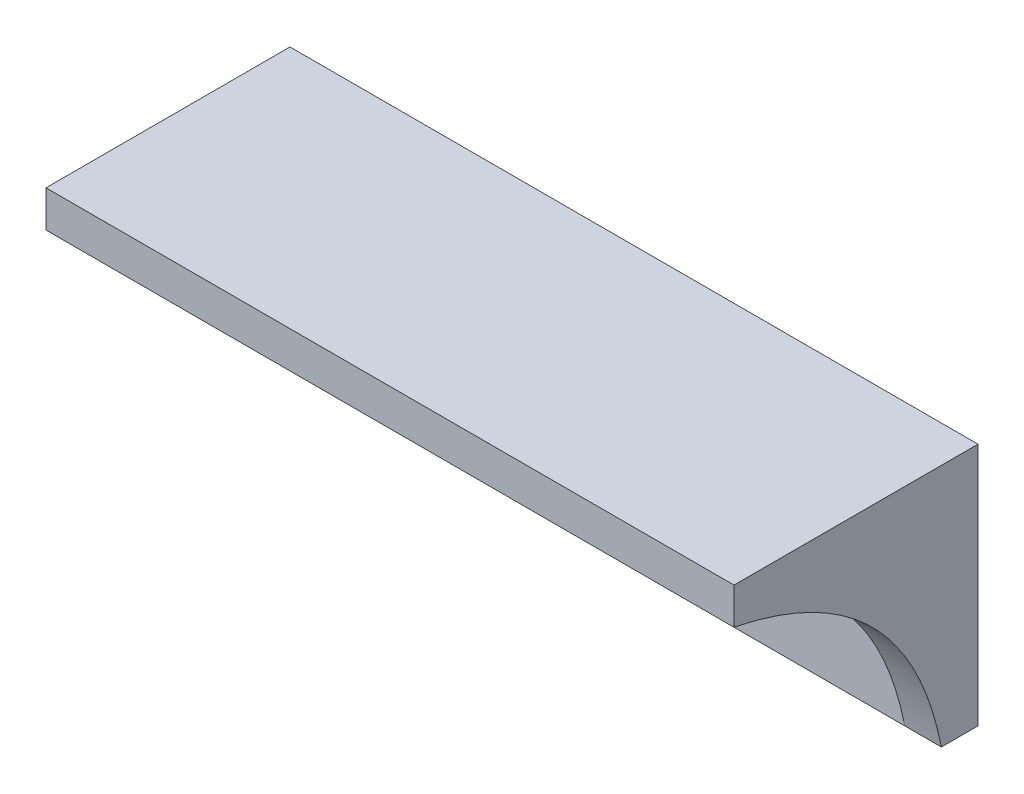
ISO-10303-21;
HEADER;
FILE_DESCRIPTION(('STEP AP214'),'2;1');
FILE_NAME('part.step','',(''),(''),'','','');
FILE_SCHEMA(('AUTOMOTIVE_DESIGN { 1 0 10303 214 1 1 1 1 }'));
ENDSEC;
DATA;
#1=APPLICATION_CONTEXT('core data for automotive mechanical design processes');
#2=APPLICATION_PROTOCOL_DEFINITION('international standard','automotive_design',2000,#1);
#3=PRODUCT_CONTEXT('',#1,'mechanical');
#4=PRODUCT('Part','Part','',(#3));
#5=PRODUCT_RELATED_PRODUCT_CATEGORY('part','',(#4));
#6=PRODUCT_DEFINITION_FORMATION('','',#4);
#7=PRODUCT_DEFINITION_CONTEXT('part definition',#1,'design');
#8=PRODUCT_DEFINITION('design','',#6,#7);
#9=PRODUCT_DEFINITION_SHAPE('','',#8);
#10=(LENGTH_UNIT() NAMED_UNIT(*) SI_UNIT(.MILLI.,.METRE.));
#11=(NAMED_UNIT(*) PLANE_ANGLE_UNIT() SI_UNIT($,.RADIAN.));
#12=(NAMED_UNIT(*) SI_UNIT($,.STERADIAN.) SOLID_ANGLE_UNIT());
#13=UNCERTAINTY_MEASURE_WITH_UNIT(LENGTH_MEASURE(1.E-05),#10,'distance_accuracy_value','');
#14=(GEOMETRIC_REPRESENTATION_CONTEXT(3) GLOBAL_UNCERTAINTY_ASSIGNED_CONTEXT((#13)) GLOBAL_UNIT_ASSIGNED_CONTEXT((#10,
#11,#12)) REPRESENTATION_CONTEXT('',''));
#15=CARTESIAN_POINT('',(0.,0.,0.));
#16=DIRECTION('',(0.,0.,1.));
#17=DIRECTION('',(1.,0.,0.));
#18=AXIS2_PLACEMENT_3D('',#15,#16,#17);
#19=CARTESIAN_POINT('',(0.,0.,3.));
#20=DIRECTION('',(0.,0.,1.));
#21=DIRECTION('',(1.,0.,0.));
#22=AXIS2_PLACEMENT_3D('',#19,#20,#21);
#23=PLANE('',#22);
#24=CARTESIAN_POINT('',(13.35,0.,3.));
#25=DIRECTION('',(0.,0.,1.));
#26=DIRECTION('',(1.,0.,0.));
#27=AXIS2_PLACEMENT_3D('',#24,#25,#26);
#28=CIRCLE('',#27,2.25);
#29=CARTESIAN_POINT('',(15.6,0.,3.));
#30=VERTEX_POINT('',#29);
#31=EDGE_CURVE('E273',#30,#30,#28,.T.);
#32=ORIENTED_EDGE('',*,*,#31,.F.);
#33=EDGE_LOOP('',(#32));
#34=FACE_BOUND('',#33,.T.);
#35=DIRECTION('',(0.,-1.,0.));
#36=VECTOR('',#35,1.);
#37=CARTESIAN_POINT('',(25.2,-10.,3.));
#38=LINE('',#37,#36);
#39=CARTESIAN_POINT('',(25.2,7.,3.));
#40=VERTEX_POINT('',#39);
#41=CARTESIAN_POINT('',(25.2,-10.,3.));
#42=VERTEX_POINT('',#41);
#43=EDGE_CURVE('E153',#40,#42,#38,.T.);
#44=ORIENTED_EDGE('',*,*,#43,.F.);
#45=DIRECTION('',(1.,0.,0.));
#46=VECTOR('',#45,1.);
#47=CARTESIAN_POINT('',(-28.2,7.,3.));
#48=LINE('',#47,#46);
#49=CARTESIAN_POINT('',(1.49999999999999,7.,3.));
#50=VERTEX_POINT('',#49);
#51=EDGE_CURVE('E278',#50,#40,#48,.T.);
#52=ORIENTED_EDGE('',*,*,#51,.F.);
#53=DIRECTION('',(0.,-1.,0.));
#54=VECTOR('',#53,1.);
#55=CARTESIAN_POINT('',(1.49999999999999,-10.,3.));
#56=LINE('',#55,#54);
#57=CARTESIAN_POINT('',(1.49999999999999,-10.,3.));
#58=VERTEX_POINT('',#57);
#59=EDGE_CURVE('E322',#50,#58,#56,.T.);
#60=ORIENTED_EDGE('',*,*,#59,.T.);
#61=DIRECTION('',(1.,0.,0.));
#62=VECTOR('',#61,1.);
#63=CARTESIAN_POINT('',(-28.2,-10.,3.));
#64=LINE('',#63,#62);
#65=EDGE_CURVE('E197',#58,#42,#64,.T.);
#66=ORIENTED_EDGE('',*,*,#65,.T.);
#67=EDGE_LOOP('',(#44,#52,#60,#66));
#68=FACE_BOUND('',#67,.T.);
#69=ADVANCED_FACE('F43',(#34,#68),#23,.T.);
#70=CARTESIAN_POINT('',(-28.2,7.,20.));
#71=DIRECTION('',(0.,1.,0.));
#72=DIRECTION('',(-1.,0.,0.));
#73=AXIS2_PLACEMENT_3D('',#70,#71,#72);
#74=PLANE('',#73);
#75=ORIENTED_EDGE('',*,*,#51,.T.);
#76=DIRECTION('',(0.,0.,-1.));
#77=VECTOR('',#76,1.);
#78=CARTESIAN_POINT('',(25.2,7.,3.));
#79=LINE('',#78,#77);
#80=CARTESIAN_POINT('',(25.2,6.99999999999999,20.));
#81=VERTEX_POINT('',#80);
#82=EDGE_CURVE('E281',#81,#40,#79,.T.);
#83=ORIENTED_EDGE('',*,*,#82,.F.);
#84=DIRECTION('',(1.,0.,0.));
#85=VECTOR('',#84,1.);
#86=CARTESIAN_POINT('',(-28.2,7.,20.));
#87=LINE('',#86,#85);
#88=CARTESIAN_POINT('',(1.49999999999999,7.,20.));
#89=VERTEX_POINT('',#88);
#90=EDGE_CURVE('E180',#89,#81,#87,.T.);
#91=ORIENTED_EDGE('',*,*,#90,.F.);
#92=DIRECTION('',(0.,0.,-1.));
#93=VECTOR('',#92,1.);
#94=CARTESIAN_POINT('',(1.49999999999999,7.,3.));
#95=LINE('',#94,#93);
#96=EDGE_CURVE('E285',#89,#50,#95,.T.);
#97=ORIENTED_EDGE('',*,*,#96,.T.);
#98=EDGE_LOOP('',(#75,#83,#91,#97));
#99=FACE_BOUND('',#98,.T.);
#100=ADVANCED_FACE('F246',(#99),#74,.F.);
#101=CARTESIAN_POINT('',(-13.35,0.,3.));
#102=DIRECTION('',(0.,0.,1.));
#103=DIRECTION('',(1.,0.,0.));
#104=AXIS2_PLACEMENT_3D('',#101,#102,#103);
#105=CIRCLE('',#104,2.25);
#106=CARTESIAN_POINT('',(-11.1,0.,3.));
#107=VERTEX_POINT('',#106);
#108=EDGE_CURVE('E402',#107,#107,#105,.T.);
#109=ORIENTED_EDGE('',*,*,#108,.F.);
#110=EDGE_LOOP('',(#109));
#111=FACE_BOUND('',#110,.T.);
#112=DIRECTION('',(0.,-1.,0.));
#113=VECTOR('',#112,1.);
#114=CARTESIAN_POINT('',(-1.50000000000001,-10.,3.));
#115=LINE('',#114,#113);
#116=CARTESIAN_POINT('',(-1.50000000000001,7.,3.));
#117=VERTEX_POINT('',#116);
#118=CARTESIAN_POINT('',(-1.50000000000001,-10.,3.));
#119=VERTEX_POINT('',#118);
#120=EDGE_CURVE('E305',#117,#119,#115,.T.);
#121=ORIENTED_EDGE('',*,*,#120,.F.);
#122=CARTESIAN_POINT('',(-25.2,7.,3.));
#123=VERTEX_POINT('',#122);
#124=EDGE_CURVE('E205',#123,#117,#48,.T.);
#125=ORIENTED_EDGE('',*,*,#124,.F.);
#126=DIRECTION('',(0.,-1.,0.));
#127=VECTOR('',#126,1.);
#128=CARTESIAN_POINT('',(-25.2,-10.,3.));
#129=LINE('',#128,#127);
#130=CARTESIAN_POINT('',(-25.2,-10.,3.));
#131=VERTEX_POINT('',#130);
#132=EDGE_CURVE('E287',#123,#131,#129,.T.);
#133=ORIENTED_EDGE('',*,*,#132,.T.);
#134=EDGE_CURVE('E166',#131,#119,#64,.T.);
#135=ORIENTED_EDGE('',*,*,#134,.T.);
#136=EDGE_LOOP('',(#121,#125,#133,#135));
#137=FACE_BOUND('',#136,.T.);
#138=ADVANCED_FACE('F244',(#111,#137),#23,.T.);
#139=ORIENTED_EDGE('',*,*,#124,.T.);
#140=DIRECTION('',(0.,0.,-1.));
#141=VECTOR('',#140,1.);
#142=CARTESIAN_POINT('',(-1.50000000000001,7.,3.));
#143=LINE('',#142,#141);
#144=CARTESIAN_POINT('',(-1.50000000000001,6.99999999999999,20.));
#145=VERTEX_POINT('',#144);
#146=EDGE_CURVE('E310',#145,#117,#143,.T.);
#147=ORIENTED_EDGE('',*,*,#146,.F.);
#148=CARTESIAN_POINT('',(-25.2,7.,20.));
#149=VERTEX_POINT('',#148);
#150=EDGE_CURVE('E174',#149,#145,#87,.T.);
#151=ORIENTED_EDGE('',*,*,#150,.F.);
#152=DIRECTION('',(0.,0.,-1.));
#153=VECTOR('',#152,1.);
#154=CARTESIAN_POINT('',(-25.2,7.,3.));
#155=LINE('',#154,#153);
#156=EDGE_CURVE('E214',#149,#123,#155,.T.);
#157=ORIENTED_EDGE('',*,*,#156,.T.);
#158=EDGE_LOOP('',(#139,#147,#151,#157));
#159=FACE_BOUND('',#158,.T.);
#160=ADVANCED_FACE('F241',(#159),#74,.F.);
#161=CARTESIAN_POINT('',(28.2,10.,3.));
#162=DIRECTION('',(-1.,0.,0.));
#163=DIRECTION('',(0.,-1.,0.));
#164=AXIS2_PLACEMENT_3D('',#161,#162,#163);
#165=PLANE('',#164);
#166=DIRECTION('',(0.,1.,0.));
#167=VECTOR('',#166,1.);
#168=CARTESIAN_POINT('',(28.2,10.,0.));
#169=LINE('',#168,#167);
#170=CARTESIAN_POINT('',(28.2,-10.,0.));
#171=VERTEX_POINT('',#170);
#172=CARTESIAN_POINT('',(28.2,10.,0.));
#173=VERTEX_POINT('',#172);
#174=EDGE_CURVE('E206',#171,#173,#169,.T.);
#175=ORIENTED_EDGE('',*,*,#174,.T.);
#176=DIRECTION('',(0.,0.,-1.));
#177=VECTOR('',#176,1.);
#178=CARTESIAN_POINT('',(28.2,10.,3.));
#179=LINE('',#178,#177);
#180=CARTESIAN_POINT('',(28.2,10.,20.));
#181=VERTEX_POINT('',#180);
#182=EDGE_CURVE('E11',#181,#173,#179,.T.);
#183=ORIENTED_EDGE('',*,*,#182,.F.);
#184=DIRECTION('',(0.,1.,0.));
#185=VECTOR('',#184,1.);
#186=CARTESIAN_POINT('',(28.2,10.,20.));
#187=LINE('',#186,#185);
#188=CARTESIAN_POINT('',(28.2,7.,20.));
#189=VERTEX_POINT('',#188);
#190=EDGE_CURVE('E151',#189,#181,#187,.T.);
#191=ORIENTED_EDGE('',*,*,#190,.F.);
#192=CARTESIAN_POINT('',(28.2,-10.,3.));
#193=CARTESIAN_POINT('',(28.2,4.16666666666667,5.83333333333333));
#194=CARTESIAN_POINT('',(28.2,7.,20.));
#195=B_SPLINE_CURVE_WITH_KNOTS('',2,(#192,#193,#194),.UNSPECIFIED.,.F.,.F.,(3,3),(0.,1.),.UNSPECIFIED.);
#196=CARTESIAN_POINT('',(28.2,-10.,3.));
#197=VERTEX_POINT('',#196);
#198=EDGE_CURVE('E131',#197,#189,#195,.T.);
#199=ORIENTED_EDGE('',*,*,#198,.F.);
#200=DIRECTION('',(0.,0.,-1.));
#201=VECTOR('',#200,1.);
#202=CARTESIAN_POINT('',(28.2,-10.,3.));
#203=LINE('',#202,#201);
#204=EDGE_CURVE('E148',#197,#171,#203,.T.);
#205=ORIENTED_EDGE('',*,*,#204,.T.);
#206=EDGE_LOOP('',(#175,#183,#191,#199,#205));
#207=FACE_BOUND('',#206,.T.);
#208=ADVANCED_FACE('F45',(#207),#165,.F.);
#209=CARTESIAN_POINT('',(-28.2,10.,3.));
#210=DIRECTION('',(0.,-1.,0.));
#211=DIRECTION('',(0.,0.,-1.));
#212=AXIS2_PLACEMENT_3D('',#209,#210,#211);
#213=PLANE('',#212);
#214=DIRECTION('',(-1.,0.,0.));
#215=VECTOR('',#214,1.);
#216=CARTESIAN_POINT('',(-28.2,10.,0.));
#217=LINE('',#216,#215);
#218=CARTESIAN_POINT('',(-28.2,10.,0.));
#219=VERTEX_POINT('',#218);
#220=EDGE_CURVE('E344',#173,#219,#217,.T.);
#221=ORIENTED_EDGE('',*,*,#220,.T.);
#222=DIRECTION('',(0.,0.,-1.));
#223=VECTOR('',#222,1.);
#224=CARTESIAN_POINT('',(-28.2,10.,3.));
#225=LINE('',#224,#223);
#226=CARTESIAN_POINT('',(-28.2,10.,20.));
#227=VERTEX_POINT('',#226);
#228=EDGE_CURVE('E53',#227,#219,#225,.T.);
#229=ORIENTED_EDGE('',*,*,#228,.F.);
#230=DIRECTION('',(-1.,0.,0.));
#231=VECTOR('',#230,1.);
#232=CARTESIAN_POINT('',(-28.2,10.,20.));
#233=LINE('',#232,#231);
#234=EDGE_CURVE('E340',#181,#227,#233,.T.);
#235=ORIENTED_EDGE('',*,*,#234,.F.);
#236=ORIENTED_EDGE('',*,*,#182,.T.);
#237=EDGE_LOOP('',(#221,#229,#235,#236));
#238=FACE_BOUND('',#237,.T.);
#239=ADVANCED_FACE('F257',(#238),#213,.F.);
#240=CARTESIAN_POINT('',(-28.2,10.,3.));
#241=DIRECTION('',(1.,0.,0.));
#242=DIRECTION('',(0.,1.,0.));
#243=AXIS2_PLACEMENT_3D('',#240,#241,#242);
#244=PLANE('',#243);
#245=DIRECTION('',(0.,0.,-1.));
#246=VECTOR('',#245,1.);
#247=CARTESIAN_POINT('',(-28.2,-10.,3.));
#248=LINE('',#247,#246);
#249=CARTESIAN_POINT('',(-28.2,-10.,3.));
#250=VERTEX_POINT('',#249);
#251=CARTESIAN_POINT('',(-28.2,-10.,0.));
#252=VERTEX_POINT('',#251);
#253=EDGE_CURVE('E160',#250,#252,#248,.T.);
#254=ORIENTED_EDGE('',*,*,#253,.F.);
#255=CARTESIAN_POINT('',(-28.2,-10.,3.));
#256=CARTESIAN_POINT('',(-28.2,4.16666666666667,5.83333333333333));
#257=CARTESIAN_POINT('',(-28.2,7.,20.));
#258=B_SPLINE_CURVE_WITH_KNOTS('',2,(#255,#256,#257),.UNSPECIFIED.,.F.,.F.,(3,3),(0.,1.),.UNSPECIFIED.);
#259=CARTESIAN_POINT('',(-28.2,6.99999999999999,20.));
#260=VERTEX_POINT('',#259);
#261=EDGE_CURVE('E215',#250,#260,#258,.T.);
#262=ORIENTED_EDGE('',*,*,#261,.T.);
#263=DIRECTION('',(0.,-1.,0.));
#264=VECTOR('',#263,1.);
#265=CARTESIAN_POINT('',(-28.2,10.,20.));
#266=LINE('',#265,#264);
#267=EDGE_CURVE('E185',#227,#260,#266,.T.);
#268=ORIENTED_EDGE('',*,*,#267,.F.);
#269=ORIENTED_EDGE('',*,*,#228,.T.);
#270=DIRECTION('',(0.,-1.,0.));
#271=VECTOR('',#270,1.);
#272=CARTESIAN_POINT('',(-28.2,10.,0.));
#273=LINE('',#272,#271);
#274=EDGE_CURVE('E346',#219,#252,#273,.T.);
#275=ORIENTED_EDGE('',*,*,#274,.T.);
#276=EDGE_LOOP('',(#254,#262,#268,#269,#275));
#277=FACE_BOUND('',#276,.T.);
#278=ADVANCED_FACE('F255',(#277),#244,.F.);
#279=CARTESIAN_POINT('',(-28.2,-10.,3.));
#280=DIRECTION('',(0.,1.,0.));
#281=DIRECTION('',(0.,0.,1.));
#282=AXIS2_PLACEMENT_3D('',#279,#280,#281);
#283=PLANE('',#282);
#284=DIRECTION('',(1.,0.,0.));
#285=VECTOR('',#284,1.);
#286=CARTESIAN_POINT('',(-28.2,-10.,0.));
#287=LINE('',#286,#285);
#288=EDGE_CURVE('E158',#252,#171,#287,.T.);
#289=ORIENTED_EDGE('',*,*,#288,.T.);
#290=ORIENTED_EDGE('',*,*,#204,.F.);
#291=DIRECTION('',(-1.,0.,0.));
#292=VECTOR('',#291,1.);
#293=CARTESIAN_POINT('',(28.2,-10.,3.));
#294=LINE('',#293,#292);
#295=EDGE_CURVE('E128',#197,#42,#294,.T.);
#296=ORIENTED_EDGE('',*,*,#295,.T.);
#297=ORIENTED_EDGE('',*,*,#65,.F.);
#298=DIRECTION('',(-1.,0.,0.));
#299=VECTOR('',#298,1.);
#300=CARTESIAN_POINT('',(1.49999999999999,-10.,3.));
#301=LINE('',#300,#299);
#302=EDGE_CURVE('E317',#58,#119,#301,.T.);
#303=ORIENTED_EDGE('',*,*,#302,.T.);
#304=ORIENTED_EDGE('',*,*,#134,.F.);
#305=EDGE_CURVE('E161',#250,#131,#64,.T.);
#306=ORIENTED_EDGE('',*,*,#305,.F.);
#307=ORIENTED_EDGE('',*,*,#253,.T.);
#308=EDGE_LOOP('',(#289,#290,#296,#297,#303,#304,#306,#307));
#309=FACE_BOUND('',#308,.T.);
#310=ADVANCED_FACE('F155',(#309),#283,.F.);
#311=CARTESIAN_POINT('',(0.,0.,0.));
#312=DIRECTION('',(0.,0.,1.));
#313=DIRECTION('',(1.,0.,0.));
#314=AXIS2_PLACEMENT_3D('',#311,#312,#313);
#315=PLANE('',#314);
#316=CARTESIAN_POINT('',(-13.35,0.,0.));
#317=DIRECTION('',(0.,0.,1.));
#318=DIRECTION('',(1.,0.,0.));
#319=AXIS2_PLACEMENT_3D('',#316,#317,#318);
#320=CIRCLE('',#319,2.25);
#321=CARTESIAN_POINT('',(-11.1,0.,0.));
#322=VERTEX_POINT('',#321);
#323=EDGE_CURVE('E399',#322,#322,#320,.T.);
#324=ORIENTED_EDGE('',*,*,#323,.T.);
#325=EDGE_LOOP('',(#324));
#326=FACE_BOUND('',#325,.T.);
#327=CARTESIAN_POINT('',(13.35,0.,0.));
#328=DIRECTION('',(0.,0.,1.));
#329=DIRECTION('',(1.,0.,0.));
#330=AXIS2_PLACEMENT_3D('',#327,#328,#329);
#331=CIRCLE('',#330,2.25);
#332=CARTESIAN_POINT('',(15.6,0.,0.));
#333=VERTEX_POINT('',#332);
#334=EDGE_CURVE('E376',#333,#333,#331,.T.);
#335=ORIENTED_EDGE('',*,*,#334,.T.);
#336=EDGE_LOOP('',(#335));
#337=FACE_BOUND('',#336,.T.);
#338=ORIENTED_EDGE('',*,*,#174,.F.);
#339=ORIENTED_EDGE('',*,*,#288,.F.);
#340=ORIENTED_EDGE('',*,*,#274,.F.);
#341=ORIENTED_EDGE('',*,*,#220,.F.);
#342=EDGE_LOOP('',(#338,#339,#340,#341));
#343=FACE_BOUND('',#342,.T.);
#344=ADVANCED_FACE('F239',(#326,#337,#343),#315,.F.);
#345=CARTESIAN_POINT('',(0.,0.,20.));
#346=DIRECTION('',(0.,0.,1.));
#347=DIRECTION('',(1.,0.,0.));
#348=AXIS2_PLACEMENT_3D('',#345,#346,#347);
#349=PLANE('',#348);
#350=ORIENTED_EDGE('',*,*,#267,.T.);
#351=EDGE_CURVE('E179',#260,#149,#87,.T.);
#352=ORIENTED_EDGE('',*,*,#351,.T.);
#353=ORIENTED_EDGE('',*,*,#150,.T.);
#354=DIRECTION('',(-1.,0.,0.));
#355=VECTOR('',#354,1.);
#356=CARTESIAN_POINT('',(1.49999999999999,7.,20.));
#357=LINE('',#356,#355);
#358=EDGE_CURVE('E221',#89,#145,#357,.T.);
#359=ORIENTED_EDGE('',*,*,#358,.F.);
#360=ORIENTED_EDGE('',*,*,#90,.T.);
#361=DIRECTION('',(-1.,0.,0.));
#362=VECTOR('',#361,1.);
#363=CARTESIAN_POINT('',(28.2,7.,20.));
#364=LINE('',#363,#362);
#365=EDGE_CURVE('E142',#189,#81,#364,.T.);
#366=ORIENTED_EDGE('',*,*,#365,.F.);
#367=ORIENTED_EDGE('',*,*,#190,.T.);
#368=ORIENTED_EDGE('',*,*,#234,.T.);
#369=EDGE_LOOP('',(#350,#352,#353,#359,#360,#366,#367,#368));
#370=FACE_BOUND('',#369,.T.);
#371=ADVANCED_FACE('F235',(#370),#349,.T.);
#372=CARTESIAN_POINT('',(-25.2,-10.,3.));
#373=CARTESIAN_POINT('',(-25.2,4.16666666666667,5.83333333333333));
#374=CARTESIAN_POINT('',(-25.2,7.,20.));
#375=B_SPLINE_CURVE_WITH_KNOTS('',2,(#372,#373,#374),.UNSPECIFIED.,.F.,.F.,(3,3),(0.,1.),.UNSPECIFIED.);
#376=DIRECTION('',(-1.,0.,0.));
#377=VECTOR('',#376,1.);
#378=SURFACE_OF_LINEAR_EXTRUSION('',#375,#377);
#379=ORIENTED_EDGE('',*,*,#261,.F.);
#380=ORIENTED_EDGE('',*,*,#305,.T.);
#381=EDGE_CURVE('E69',#131,#149,#375,.T.);
#382=ORIENTED_EDGE('',*,*,#381,.T.);
#383=ORIENTED_EDGE('',*,*,#351,.F.);
#384=EDGE_LOOP('',(#379,#380,#382,#383));
#385=FACE_BOUND('',#384,.T.);
#386=ADVANCED_FACE('F230',(#385),#378,.T.);
#387=CARTESIAN_POINT('',(-25.2,1.33333333333334,8.66666666666667));
#388=DIRECTION('',(-1.,0.,0.));
#389=DIRECTION('',(0.,0.,1.));
#390=AXIS2_PLACEMENT_3D('',#387,#388,#389);
#391=PLANE('',#390);
#392=ORIENTED_EDGE('',*,*,#381,.F.);
#393=ORIENTED_EDGE('',*,*,#132,.F.);
#394=ORIENTED_EDGE('',*,*,#156,.F.);
#395=EDGE_LOOP('',(#392,#393,#394));
#396=FACE_BOUND('',#395,.T.);
#397=ADVANCED_FACE('F234',(#396),#391,.F.);
#398=CARTESIAN_POINT('',(1.49999999999999,-10.,3.));
#399=CARTESIAN_POINT('',(1.49999999999999,4.16666666666667,5.83333333333333));
#400=CARTESIAN_POINT('',(1.49999999999999,7.,20.));
#401=B_SPLINE_CURVE_WITH_KNOTS('',2,(#398,#399,#400),.UNSPECIFIED.,.F.,.F.,(3,3),(0.,1.),.UNSPECIFIED.);
#402=DIRECTION('',(-1.,0.,0.));
#403=VECTOR('',#402,1.);
#404=SURFACE_OF_LINEAR_EXTRUSION('',#401,#403);
#405=CARTESIAN_POINT('',(-1.50000000000001,-10.,3.));
#406=CARTESIAN_POINT('',(-1.50000000000001,4.16666666666667,5.83333333333333));
#407=CARTESIAN_POINT('',(-1.50000000000001,7.,20.));
#408=B_SPLINE_CURVE_WITH_KNOTS('',2,(#405,#406,#407),.UNSPECIFIED.,.F.,.F.,(3,3),(0.,1.),.UNSPECIFIED.);
#409=EDGE_CURVE('E141',#119,#145,#408,.T.);
#410=ORIENTED_EDGE('',*,*,#409,.F.);
#411=ORIENTED_EDGE('',*,*,#302,.F.);
#412=EDGE_CURVE('E61',#58,#89,#401,.T.);
#413=ORIENTED_EDGE('',*,*,#412,.T.);
#414=ORIENTED_EDGE('',*,*,#358,.T.);
#415=EDGE_LOOP('',(#410,#411,#413,#414));
#416=FACE_BOUND('',#415,.T.);
#417=ADVANCED_FACE('F355',(#416),#404,.T.);
#418=CARTESIAN_POINT('',(1.49999999999999,1.33333333333334,8.66666666666667));
#419=DIRECTION('',(-1.,0.,0.));
#420=DIRECTION('',(0.,0.,1.));
#421=AXIS2_PLACEMENT_3D('',#418,#419,#420);
#422=PLANE('',#421);
#423=ORIENTED_EDGE('',*,*,#412,.F.);
#424=ORIENTED_EDGE('',*,*,#59,.F.);
#425=ORIENTED_EDGE('',*,*,#96,.F.);
#426=EDGE_LOOP('',(#423,#424,#425));
#427=FACE_BOUND('',#426,.T.);
#428=ADVANCED_FACE('F359',(#427),#422,.F.);
#429=CARTESIAN_POINT('',(-1.50000000000001,1.33333333333334,8.66666666666667));
#430=DIRECTION('',(-1.,0.,0.));
#431=DIRECTION('',(0.,0.,1.));
#432=AXIS2_PLACEMENT_3D('',#429,#430,#431);
#433=PLANE('',#432);
#434=ORIENTED_EDGE('',*,*,#409,.T.);
#435=ORIENTED_EDGE('',*,*,#146,.T.);
#436=ORIENTED_EDGE('',*,*,#120,.T.);
#437=EDGE_LOOP('',(#434,#435,#436));
#438=FACE_BOUND('',#437,.T.);
#439=ADVANCED_FACE('F334',(#438),#433,.T.);
#440=DIRECTION('',(-1.,0.,0.));
#441=VECTOR('',#440,1.);
#442=SURFACE_OF_LINEAR_EXTRUSION('',#195,#441);
#443=CARTESIAN_POINT('',(25.2,-10.,3.));
#444=CARTESIAN_POINT('',(25.2,4.16666666666667,5.83333333333333));
#445=CARTESIAN_POINT('',(25.2,7.,20.));
#446=B_SPLINE_CURVE_WITH_KNOTS('',2,(#443,#444,#445),.UNSPECIFIED.,.F.,.F.,(3,3),(0.,1.),.UNSPECIFIED.);
#447=EDGE_CURVE('E134',#42,#81,#446,.T.);
#448=ORIENTED_EDGE('',*,*,#447,.F.);
#449=ORIENTED_EDGE('',*,*,#295,.F.);
#450=ORIENTED_EDGE('',*,*,#198,.T.);
#451=ORIENTED_EDGE('',*,*,#365,.T.);
#452=EDGE_LOOP('',(#448,#449,#450,#451));
#453=FACE_BOUND('',#452,.T.);
#454=ADVANCED_FACE('F130',(#453),#442,.T.);
#455=CARTESIAN_POINT('',(25.2,1.33333333333334,8.66666666666667));
#456=DIRECTION('',(-1.,0.,0.));
#457=DIRECTION('',(0.,0.,1.));
#458=AXIS2_PLACEMENT_3D('',#455,#456,#457);
#459=PLANE('',#458);
#460=ORIENTED_EDGE('',*,*,#447,.T.);
#461=ORIENTED_EDGE('',*,*,#82,.T.);
#462=ORIENTED_EDGE('',*,*,#43,.T.);
#463=EDGE_LOOP('',(#460,#461,#462));
#464=FACE_BOUND('',#463,.T.);
#465=ADVANCED_FACE('F384',(#464),#459,.T.);
#466=CARTESIAN_POINT('',(13.35,0.,3.));
#467=DIRECTION('',(0.,0.,1.));
#468=DIRECTION('',(1.,0.,0.));
#469=AXIS2_PLACEMENT_3D('',#466,#467,#468);
#470=CYLINDRICAL_SURFACE('',#469,2.25);
#471=ORIENTED_EDGE('',*,*,#334,.F.);
#472=EDGE_LOOP('',(#471));
#473=FACE_BOUND('',#472,.T.);
#474=ORIENTED_EDGE('',*,*,#31,.T.);
#475=EDGE_LOOP('',(#474));
#476=FACE_BOUND('',#475,.T.);
#477=ADVANCED_FACE('F387',(#473,#476),#470,.F.);
#478=CARTESIAN_POINT('',(-13.35,0.,3.));
#479=DIRECTION('',(0.,0.,1.));
#480=DIRECTION('',(1.,0.,0.));
#481=AXIS2_PLACEMENT_3D('',#478,#479,#480);
#482=CYLINDRICAL_SURFACE('',#481,2.25);
#483=ORIENTED_EDGE('',*,*,#323,.F.);
#484=EDGE_LOOP('',(#483));
#485=FACE_BOUND('',#484,.T.);
#486=ORIENTED_EDGE('',*,*,#108,.T.);
#487=EDGE_LOOP('',(#486));
#488=FACE_BOUND('',#487,.T.);
#489=ADVANCED_FACE('F390',(#485,#488),#482,.F.);
#490=CLOSED_SHELL('',(#69,#100,#138,#160,#208,#239,#278,#310,#344,#371,#386,#397,#417,#428,#439,
#454,#465,#477,#489));
#491=MANIFOLD_SOLID_BREP('B2',#490);
#492=ADVANCED_BREP_SHAPE_REPRESENTATION('',(#18,#491),#14);
#493=SHAPE_DEFINITION_REPRESENTATION(#9,#492);
ENDSEC;
END-ISO-10303-21;
